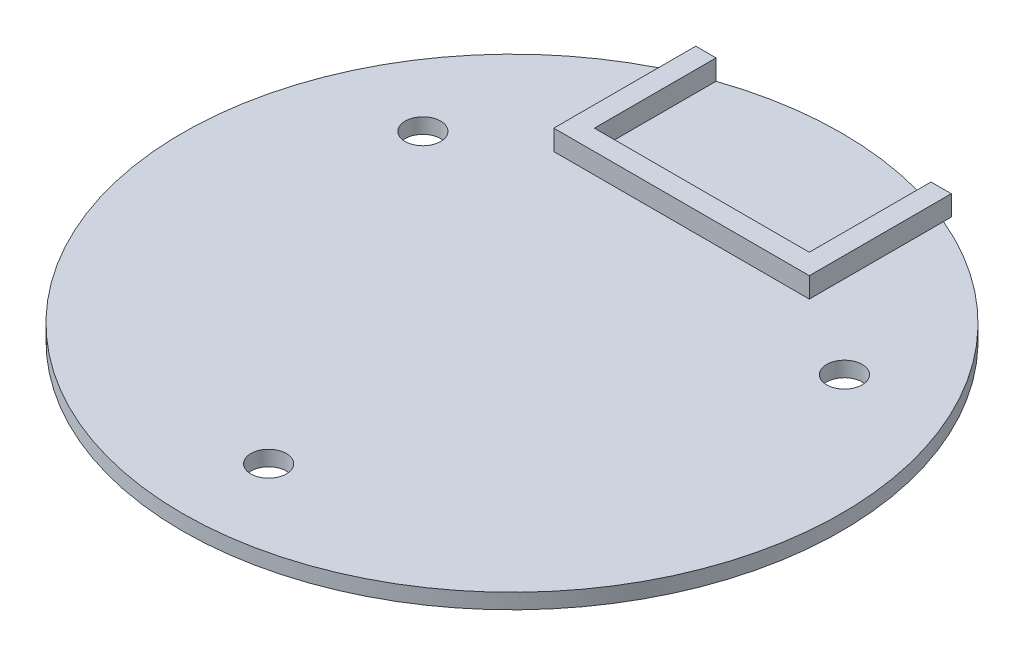
ISO-10303-21;
HEADER;
FILE_DESCRIPTION(('STEP AP214'),'2;1');
FILE_NAME('part.step','',(''),(''),'','','');
FILE_SCHEMA(('AUTOMOTIVE_DESIGN { 1 0 10303 214 1 1 1 1 }'));
ENDSEC;
DATA;
#1=APPLICATION_CONTEXT('core data for automotive mechanical design processes');
#2=APPLICATION_PROTOCOL_DEFINITION('international standard','automotive_design',2000,#1);
#3=PRODUCT_CONTEXT('',#1,'mechanical');
#4=PRODUCT('Part','Part','',(#3));
#5=PRODUCT_RELATED_PRODUCT_CATEGORY('part','',(#4));
#6=PRODUCT_DEFINITION_FORMATION('','',#4);
#7=PRODUCT_DEFINITION_CONTEXT('part definition',#1,'design');
#8=PRODUCT_DEFINITION('design','',#6,#7);
#9=PRODUCT_DEFINITION_SHAPE('','',#8);
#10=(LENGTH_UNIT() NAMED_UNIT(*) SI_UNIT(.MILLI.,.METRE.));
#11=(NAMED_UNIT(*) PLANE_ANGLE_UNIT() SI_UNIT($,.RADIAN.));
#12=(NAMED_UNIT(*) SI_UNIT($,.STERADIAN.) SOLID_ANGLE_UNIT());
#13=UNCERTAINTY_MEASURE_WITH_UNIT(LENGTH_MEASURE(1.E-05),#10,'distance_accuracy_value','');
#14=(GEOMETRIC_REPRESENTATION_CONTEXT(3) GLOBAL_UNCERTAINTY_ASSIGNED_CONTEXT((#13)) GLOBAL_UNIT_ASSIGNED_CONTEXT((#10,
#11,#12)) REPRESENTATION_CONTEXT('',''));
#15=CARTESIAN_POINT('',(0.,0.,0.));
#16=DIRECTION('',(0.,0.,1.));
#17=DIRECTION('',(1.,0.,0.));
#18=AXIS2_PLACEMENT_3D('',#15,#16,#17);
#19=CARTESIAN_POINT('',(0.,1.5,0.));
#20=DIRECTION('',(0.,1.,0.));
#21=DIRECTION('',(0.,0.,1.));
#22=AXIS2_PLACEMENT_3D('',#19,#20,#21);
#23=PLANE('',#22);
#24=DIRECTION('',(0.,0.,-1.));
#25=VECTOR('',#24,1.);
#26=CARTESIAN_POINT('',(-10.6,1.5,-30.7227928417974));
#27=LINE('',#26,#25);
#28=CARTESIAN_POINT('',(-10.6,1.5,-18.7227928417974));
#29=VERTEX_POINT('',#28);
#30=CARTESIAN_POINT('',(-10.6,1.5,-30.7227928417974));
#31=VERTEX_POINT('',#30);
#32=EDGE_CURVE('E63',#29,#31,#27,.T.);
#33=ORIENTED_EDGE('',*,*,#32,.F.);
#34=DIRECTION('',(-1.,0.,0.));
#35=VECTOR('',#34,1.);
#36=CARTESIAN_POINT('',(-10.6,1.5,-18.7227928417974));
#37=LINE('',#36,#35);
#38=CARTESIAN_POINT('',(10.6,1.5,-18.7227928417974));
#39=VERTEX_POINT('',#38);
#40=EDGE_CURVE('E67',#39,#29,#37,.T.);
#41=ORIENTED_EDGE('',*,*,#40,.F.);
#42=DIRECTION('',(0.,0.,1.));
#43=VECTOR('',#42,1.);
#44=CARTESIAN_POINT('',(10.6,1.5,-30.7227928417974));
#45=LINE('',#44,#43);
#46=CARTESIAN_POINT('',(10.6,1.5,-30.7227928417974));
#47=VERTEX_POINT('',#46);
#48=EDGE_CURVE('E177',#47,#39,#45,.T.);
#49=ORIENTED_EDGE('',*,*,#48,.F.);
#50=CARTESIAN_POINT('',(0.,1.5,0.));
#51=DIRECTION('',(0.,1.,0.));
#52=DIRECTION('',(0.,0.,1.));
#53=AXIS2_PLACEMENT_3D('',#50,#51,#52);
#54=CIRCLE('',#53,32.5);
#55=EDGE_CURVE('E150',#47,#31,#54,.T.);
#56=ORIENTED_EDGE('',*,*,#55,.T.);
#57=EDGE_LOOP('',(#33,#41,#49,#56));
#58=FACE_BOUND('',#57,.T.);
#59=ADVANCED_FACE('F45',(#58),#23,.T.);
#60=CARTESIAN_POINT('',(0.,1.5,0.));
#61=DIRECTION('',(0.,-1.,0.));
#62=DIRECTION('',(0.,0.,-1.));
#63=AXIS2_PLACEMENT_3D('',#60,#61,#62);
#64=CYLINDRICAL_SURFACE('',#63,32.5);
#65=CARTESIAN_POINT('',(12.6,1.5,-29.9581374587941));
#66=VERTEX_POINT('',#65);
#67=EDGE_CURVE('E54',#66,#47,#54,.T.);
#68=ORIENTED_EDGE('',*,*,#67,.F.);
#69=CARTESIAN_POINT('',(-12.6,1.5,-29.9581374587941));
#70=VERTEX_POINT('',#69);
#71=EDGE_CURVE('E145',#70,#66,#54,.T.);
#72=ORIENTED_EDGE('',*,*,#71,.F.);
#73=EDGE_CURVE('E156',#31,#70,#54,.T.);
#74=ORIENTED_EDGE('',*,*,#73,.F.);
#75=ORIENTED_EDGE('',*,*,#55,.F.);
#76=EDGE_LOOP('',(#68,#72,#74,#75));
#77=FACE_BOUND('',#76,.T.);
#78=CARTESIAN_POINT('',(0.,0.,0.));
#79=DIRECTION('',(0.,1.,0.));
#80=DIRECTION('',(0.,0.,1.));
#81=AXIS2_PLACEMENT_3D('',#78,#79,#80);
#82=CIRCLE('',#81,32.5);
#83=CARTESIAN_POINT('',(0.,0.,32.5));
#84=VERTEX_POINT('',#83);
#85=EDGE_CURVE('E49',#84,#84,#82,.T.);
#86=ORIENTED_EDGE('',*,*,#85,.T.);
#87=EDGE_LOOP('',(#86));
#88=FACE_BOUND('',#87,.T.);
#89=ADVANCED_FACE('F47',(#77,#88),#64,.T.);
#90=CARTESIAN_POINT('',(20.7846096908265,1.5,-12.0000000000001));
#91=DIRECTION('',(0.,1.,0.));
#92=DIRECTION('',(0.,0.,1.));
#93=AXIS2_PLACEMENT_3D('',#90,#91,#92);
#94=CIRCLE('',#93,1.75);
#95=CARTESIAN_POINT('',(20.7846096908265,1.5,-10.2500000000001));
#96=VERTEX_POINT('',#95);
#97=EDGE_CURVE('E254',#96,#96,#94,.T.);
#98=ORIENTED_EDGE('',*,*,#97,.F.);
#99=EDGE_LOOP('',(#98));
#100=FACE_BOUND('',#99,.T.);
#101=CARTESIAN_POINT('',(-20.7846096908266,1.5,-11.9999999999998));
#102=DIRECTION('',(0.,1.,0.));
#103=DIRECTION('',(0.,0.,1.));
#104=AXIS2_PLACEMENT_3D('',#101,#102,#103);
#105=CIRCLE('',#104,1.75);
#106=CARTESIAN_POINT('',(-20.7846096908266,1.5,-10.2499999999998));
#107=VERTEX_POINT('',#106);
#108=EDGE_CURVE('E258',#107,#107,#105,.T.);
#109=ORIENTED_EDGE('',*,*,#108,.F.);
#110=EDGE_LOOP('',(#109));
#111=FACE_BOUND('',#110,.T.);
#112=CARTESIAN_POINT('',(0.,1.5,24.));
#113=DIRECTION('',(0.,1.,0.));
#114=DIRECTION('',(0.,0.,1.));
#115=AXIS2_PLACEMENT_3D('',#112,#113,#114);
#116=CIRCLE('',#115,1.75);
#117=CARTESIAN_POINT('',(0.,1.5,25.75));
#118=VERTEX_POINT('',#117);
#119=EDGE_CURVE('E168',#118,#118,#116,.T.);
#120=ORIENTED_EDGE('',*,*,#119,.F.);
#121=EDGE_LOOP('',(#120));
#122=FACE_BOUND('',#121,.T.);
#123=DIRECTION('',(0.,0.,-1.));
#124=VECTOR('',#123,1.);
#125=CARTESIAN_POINT('',(12.6,1.5,-30.7227928417974));
#126=LINE('',#125,#124);
#127=CARTESIAN_POINT('',(12.6,1.5,-16.7227928417974));
#128=VERTEX_POINT('',#127);
#129=EDGE_CURVE('E172',#128,#66,#126,.T.);
#130=ORIENTED_EDGE('',*,*,#129,.F.);
#131=DIRECTION('',(1.,0.,0.));
#132=VECTOR('',#131,1.);
#133=CARTESIAN_POINT('',(-12.6,1.5,-16.7227928417974));
#134=LINE('',#133,#132);
#135=CARTESIAN_POINT('',(-12.6,1.5,-16.7227928417974));
#136=VERTEX_POINT('',#135);
#137=EDGE_CURVE('E164',#136,#128,#134,.T.);
#138=ORIENTED_EDGE('',*,*,#137,.F.);
#139=DIRECTION('',(0.,0.,1.));
#140=VECTOR('',#139,1.);
#141=CARTESIAN_POINT('',(-12.6,1.5,-30.7227928417974));
#142=LINE('',#141,#140);
#143=EDGE_CURVE('E11',#70,#136,#142,.T.);
#144=ORIENTED_EDGE('',*,*,#143,.F.);
#145=ORIENTED_EDGE('',*,*,#71,.T.);
#146=EDGE_LOOP('',(#130,#138,#144,#145));
#147=FACE_BOUND('',#146,.T.);
#148=ADVANCED_FACE('F203',(#100,#111,#122,#147),#23,.T.);
#149=CARTESIAN_POINT('',(0.,0.,0.));
#150=DIRECTION('',(0.,1.,0.));
#151=DIRECTION('',(0.,0.,1.));
#152=AXIS2_PLACEMENT_3D('',#149,#150,#151);
#153=PLANE('',#152);
#154=CARTESIAN_POINT('',(20.7846096908265,0.,-12.0000000000001));
#155=DIRECTION('',(0.,-1.,0.));
#156=DIRECTION('',(-0.866025403784436,0.,0.500000000000004));
#157=AXIS2_PLACEMENT_3D('',#154,#155,#156);
#158=CIRCLE('',#157,1.75);
#159=CARTESIAN_POINT('',(19.2690652342037,0.,-11.1250000000001));
#160=VERTEX_POINT('',#159);
#161=EDGE_CURVE('E269',#160,#160,#158,.T.);
#162=ORIENTED_EDGE('',*,*,#161,.F.);
#163=EDGE_LOOP('',(#162));
#164=FACE_BOUND('',#163,.T.);
#165=CARTESIAN_POINT('',(-20.7846096908266,0.,-11.9999999999998));
#166=DIRECTION('',(0.,-1.,0.));
#167=DIRECTION('',(0.866025403784443,0.,0.499999999999992));
#168=AXIS2_PLACEMENT_3D('',#165,#166,#167);
#169=CIRCLE('',#168,1.75);
#170=CARTESIAN_POINT('',(-19.2690652342039,0.,-11.1249999999998));
#171=VERTEX_POINT('',#170);
#172=EDGE_CURVE('E270',#171,#171,#169,.T.);
#173=ORIENTED_EDGE('',*,*,#172,.F.);
#174=EDGE_LOOP('',(#173));
#175=FACE_BOUND('',#174,.T.);
#176=CARTESIAN_POINT('',(0.,0.,24.));
#177=DIRECTION('',(0.,-1.,0.));
#178=DIRECTION('',(0.,0.,-1.));
#179=AXIS2_PLACEMENT_3D('',#176,#177,#178);
#180=CIRCLE('',#179,1.75);
#181=CARTESIAN_POINT('',(0.,0.,22.25));
#182=VERTEX_POINT('',#181);
#183=EDGE_CURVE('E262',#182,#182,#180,.T.);
#184=ORIENTED_EDGE('',*,*,#183,.F.);
#185=EDGE_LOOP('',(#184));
#186=FACE_BOUND('',#185,.T.);
#187=ORIENTED_EDGE('',*,*,#85,.F.);
#188=EDGE_LOOP('',(#187));
#189=FACE_BOUND('',#188,.T.);
#190=ADVANCED_FACE('F244',(#164,#175,#186,#189),#153,.F.);
#191=CARTESIAN_POINT('',(0.,1.5,0.));
#192=DIRECTION('',(0.,1.,0.));
#193=DIRECTION('',(0.,0.,1.));
#194=AXIS2_PLACEMENT_3D('',#191,#192,#193);
#195=PLANE('',#194);
#196=CARTESIAN_POINT('',(12.6,1.5,-30.7227928417974));
#197=VERTEX_POINT('',#196);
#198=EDGE_CURVE('E166',#66,#197,#126,.T.);
#199=ORIENTED_EDGE('',*,*,#198,.F.);
#200=ORIENTED_EDGE('',*,*,#67,.T.);
#201=DIRECTION('',(-1.,0.,0.));
#202=VECTOR('',#201,1.);
#203=CARTESIAN_POINT('',(10.6,1.5,-30.7227928417974));
#204=LINE('',#203,#202);
#205=EDGE_CURVE('E175',#197,#47,#204,.T.);
#206=ORIENTED_EDGE('',*,*,#205,.F.);
#207=EDGE_LOOP('',(#199,#200,#206));
#208=FACE_BOUND('',#207,.T.);
#209=ADVANCED_FACE('F205',(#208),#195,.F.);
#210=DIRECTION('',(-1.,0.,0.));
#211=VECTOR('',#210,1.);
#212=CARTESIAN_POINT('',(-10.6,1.5,-30.7227928417974));
#213=LINE('',#212,#211);
#214=CARTESIAN_POINT('',(-12.6,1.5,-30.7227928417974));
#215=VERTEX_POINT('',#214);
#216=EDGE_CURVE('E142',#31,#215,#213,.T.);
#217=ORIENTED_EDGE('',*,*,#216,.F.);
#218=ORIENTED_EDGE('',*,*,#73,.T.);
#219=EDGE_CURVE('E56',#215,#70,#142,.T.);
#220=ORIENTED_EDGE('',*,*,#219,.F.);
#221=EDGE_LOOP('',(#217,#218,#220));
#222=FACE_BOUND('',#221,.T.);
#223=ADVANCED_FACE('F161',(#222),#195,.F.);
#224=CARTESIAN_POINT('',(-10.6,3.5,-30.7227928417974));
#225=DIRECTION('',(0.,0.,1.));
#226=DIRECTION('',(1.,0.,0.));
#227=AXIS2_PLACEMENT_3D('',#224,#225,#226);
#228=PLANE('',#227);
#229=ORIENTED_EDGE('',*,*,#216,.T.);
#230=DIRECTION('',(0.,-1.,0.));
#231=VECTOR('',#230,1.);
#232=CARTESIAN_POINT('',(-12.6,3.5,-30.7227928417974));
#233=LINE('',#232,#231);
#234=CARTESIAN_POINT('',(-12.6,3.5,-30.7227928417974));
#235=VERTEX_POINT('',#234);
#236=EDGE_CURVE('E123',#235,#215,#233,.T.);
#237=ORIENTED_EDGE('',*,*,#236,.F.);
#238=DIRECTION('',(-1.,0.,0.));
#239=VECTOR('',#238,1.);
#240=CARTESIAN_POINT('',(-10.6,3.5,-30.7227928417974));
#241=LINE('',#240,#239);
#242=CARTESIAN_POINT('',(-10.6,3.5,-30.7227928417974));
#243=VERTEX_POINT('',#242);
#244=EDGE_CURVE('E130',#243,#235,#241,.T.);
#245=ORIENTED_EDGE('',*,*,#244,.F.);
#246=DIRECTION('',(0.,-1.,0.));
#247=VECTOR('',#246,1.);
#248=CARTESIAN_POINT('',(-10.6,3.5,-30.7227928417974));
#249=LINE('',#248,#247);
#250=EDGE_CURVE('E181',#243,#31,#249,.T.);
#251=ORIENTED_EDGE('',*,*,#250,.T.);
#252=EDGE_LOOP('',(#229,#237,#245,#251));
#253=FACE_BOUND('',#252,.T.);
#254=ADVANCED_FACE('F140',(#253),#228,.F.);
#255=CARTESIAN_POINT('',(-12.6,3.5,-30.7227928417974));
#256=DIRECTION('',(1.,0.,0.));
#257=DIRECTION('',(0.,0.,-1.));
#258=AXIS2_PLACEMENT_3D('',#255,#256,#257);
#259=PLANE('',#258);
#260=ORIENTED_EDGE('',*,*,#219,.T.);
#261=ORIENTED_EDGE('',*,*,#143,.T.);
#262=DIRECTION('',(0.,-1.,0.));
#263=VECTOR('',#262,1.);
#264=CARTESIAN_POINT('',(-12.6,3.5,-16.7227928417974));
#265=LINE('',#264,#263);
#266=CARTESIAN_POINT('',(-12.6,3.5,-16.7227928417974));
#267=VERTEX_POINT('',#266);
#268=EDGE_CURVE('E126',#267,#136,#265,.T.);
#269=ORIENTED_EDGE('',*,*,#268,.F.);
#270=DIRECTION('',(0.,0.,1.));
#271=VECTOR('',#270,1.);
#272=CARTESIAN_POINT('',(-12.6,3.5,-30.7227928417974));
#273=LINE('',#272,#271);
#274=EDGE_CURVE('E118',#235,#267,#273,.T.);
#275=ORIENTED_EDGE('',*,*,#274,.F.);
#276=ORIENTED_EDGE('',*,*,#236,.T.);
#277=EDGE_LOOP('',(#260,#261,#269,#275,#276));
#278=FACE_BOUND('',#277,.T.);
#279=ADVANCED_FACE('F121',(#278),#259,.F.);
#280=CARTESIAN_POINT('',(-12.6,3.5,-16.7227928417974));
#281=DIRECTION('',(0.,0.,-1.));
#282=DIRECTION('',(-1.,0.,0.));
#283=AXIS2_PLACEMENT_3D('',#280,#281,#282);
#284=PLANE('',#283);
#285=ORIENTED_EDGE('',*,*,#137,.T.);
#286=DIRECTION('',(0.,-1.,0.));
#287=VECTOR('',#286,1.);
#288=CARTESIAN_POINT('',(12.6,3.5,-16.7227928417974));
#289=LINE('',#288,#287);
#290=CARTESIAN_POINT('',(12.6,3.5,-16.7227928417974));
#291=VERTEX_POINT('',#290);
#292=EDGE_CURVE('E146',#291,#128,#289,.T.);
#293=ORIENTED_EDGE('',*,*,#292,.F.);
#294=DIRECTION('',(1.,0.,0.));
#295=VECTOR('',#294,1.);
#296=CARTESIAN_POINT('',(-12.6,3.5,-16.7227928417974));
#297=LINE('',#296,#295);
#298=EDGE_CURVE('E129',#267,#291,#297,.T.);
#299=ORIENTED_EDGE('',*,*,#298,.F.);
#300=ORIENTED_EDGE('',*,*,#268,.T.);
#301=EDGE_LOOP('',(#285,#293,#299,#300));
#302=FACE_BOUND('',#301,.T.);
#303=ADVANCED_FACE('F202',(#302),#284,.F.);
#304=CARTESIAN_POINT('',(12.6,3.5,-30.7227928417974));
#305=DIRECTION('',(-1.,0.,0.));
#306=DIRECTION('',(0.,0.,1.));
#307=AXIS2_PLACEMENT_3D('',#304,#305,#306);
#308=PLANE('',#307);
#309=ORIENTED_EDGE('',*,*,#129,.T.);
#310=ORIENTED_EDGE('',*,*,#198,.T.);
#311=DIRECTION('',(0.,-1.,0.));
#312=VECTOR('',#311,1.);
#313=CARTESIAN_POINT('',(12.6,3.5,-30.7227928417974));
#314=LINE('',#313,#312);
#315=CARTESIAN_POINT('',(12.6,3.5,-30.7227928417974));
#316=VERTEX_POINT('',#315);
#317=EDGE_CURVE('E192',#316,#197,#314,.T.);
#318=ORIENTED_EDGE('',*,*,#317,.F.);
#319=DIRECTION('',(0.,0.,-1.));
#320=VECTOR('',#319,1.);
#321=CARTESIAN_POINT('',(12.6,3.5,-30.7227928417974));
#322=LINE('',#321,#320);
#323=EDGE_CURVE('E200',#291,#316,#322,.T.);
#324=ORIENTED_EDGE('',*,*,#323,.F.);
#325=ORIENTED_EDGE('',*,*,#292,.T.);
#326=EDGE_LOOP('',(#309,#310,#318,#324,#325));
#327=FACE_BOUND('',#326,.T.);
#328=ADVANCED_FACE('F198',(#327),#308,.F.);
#329=CARTESIAN_POINT('',(10.6,3.5,-30.7227928417974));
#330=DIRECTION('',(0.,0.,1.));
#331=DIRECTION('',(1.,0.,0.));
#332=AXIS2_PLACEMENT_3D('',#329,#330,#331);
#333=PLANE('',#332);
#334=ORIENTED_EDGE('',*,*,#205,.T.);
#335=DIRECTION('',(0.,-1.,0.));
#336=VECTOR('',#335,1.);
#337=CARTESIAN_POINT('',(10.6,3.5,-30.7227928417974));
#338=LINE('',#337,#336);
#339=CARTESIAN_POINT('',(10.6,3.5,-30.7227928417974));
#340=VERTEX_POINT('',#339);
#341=EDGE_CURVE('E189',#340,#47,#338,.T.);
#342=ORIENTED_EDGE('',*,*,#341,.F.);
#343=DIRECTION('',(-1.,0.,0.));
#344=VECTOR('',#343,1.);
#345=CARTESIAN_POINT('',(10.6,3.5,-30.7227928417974));
#346=LINE('',#345,#344);
#347=EDGE_CURVE('E210',#316,#340,#346,.T.);
#348=ORIENTED_EDGE('',*,*,#347,.F.);
#349=ORIENTED_EDGE('',*,*,#317,.T.);
#350=EDGE_LOOP('',(#334,#342,#348,#349));
#351=FACE_BOUND('',#350,.T.);
#352=ADVANCED_FACE('F208',(#351),#333,.F.);
#353=CARTESIAN_POINT('',(10.6,3.5,-30.7227928417974));
#354=DIRECTION('',(1.,0.,0.));
#355=DIRECTION('',(0.,0.,-1.));
#356=AXIS2_PLACEMENT_3D('',#353,#354,#355);
#357=PLANE('',#356);
#358=ORIENTED_EDGE('',*,*,#48,.T.);
#359=DIRECTION('',(0.,-1.,0.));
#360=VECTOR('',#359,1.);
#361=CARTESIAN_POINT('',(10.6,3.5,-18.7227928417974));
#362=LINE('',#361,#360);
#363=CARTESIAN_POINT('',(10.6,3.5,-18.7227928417974));
#364=VERTEX_POINT('',#363);
#365=EDGE_CURVE('E186',#364,#39,#362,.T.);
#366=ORIENTED_EDGE('',*,*,#365,.F.);
#367=DIRECTION('',(0.,0.,1.));
#368=VECTOR('',#367,1.);
#369=CARTESIAN_POINT('',(10.6,3.5,-30.7227928417974));
#370=LINE('',#369,#368);
#371=EDGE_CURVE('E212',#340,#364,#370,.T.);
#372=ORIENTED_EDGE('',*,*,#371,.F.);
#373=ORIENTED_EDGE('',*,*,#341,.T.);
#374=EDGE_LOOP('',(#358,#366,#372,#373));
#375=FACE_BOUND('',#374,.T.);
#376=ADVANCED_FACE('F234',(#375),#357,.F.);
#377=CARTESIAN_POINT('',(-10.6,3.5,-18.7227928417974));
#378=DIRECTION('',(0.,0.,1.));
#379=DIRECTION('',(1.,0.,0.));
#380=AXIS2_PLACEMENT_3D('',#377,#378,#379);
#381=PLANE('',#380);
#382=ORIENTED_EDGE('',*,*,#40,.T.);
#383=DIRECTION('',(0.,-1.,0.));
#384=VECTOR('',#383,1.);
#385=CARTESIAN_POINT('',(-10.6,3.5,-18.7227928417974));
#386=LINE('',#385,#384);
#387=CARTESIAN_POINT('',(-10.6,3.5,-18.7227928417974));
#388=VERTEX_POINT('',#387);
#389=EDGE_CURVE('E183',#388,#29,#386,.T.);
#390=ORIENTED_EDGE('',*,*,#389,.F.);
#391=DIRECTION('',(-1.,0.,0.));
#392=VECTOR('',#391,1.);
#393=CARTESIAN_POINT('',(-10.6,3.5,-18.7227928417974));
#394=LINE('',#393,#392);
#395=EDGE_CURVE('E214',#364,#388,#394,.T.);
#396=ORIENTED_EDGE('',*,*,#395,.F.);
#397=ORIENTED_EDGE('',*,*,#365,.T.);
#398=EDGE_LOOP('',(#382,#390,#396,#397));
#399=FACE_BOUND('',#398,.T.);
#400=ADVANCED_FACE('F223',(#399),#381,.F.);
#401=CARTESIAN_POINT('',(-10.6,3.5,-30.7227928417974));
#402=DIRECTION('',(-1.,0.,0.));
#403=DIRECTION('',(0.,0.,1.));
#404=AXIS2_PLACEMENT_3D('',#401,#402,#403);
#405=PLANE('',#404);
#406=ORIENTED_EDGE('',*,*,#32,.T.);
#407=ORIENTED_EDGE('',*,*,#250,.F.);
#408=DIRECTION('',(0.,0.,-1.));
#409=VECTOR('',#408,1.);
#410=CARTESIAN_POINT('',(-10.6,3.5,-30.7227928417974));
#411=LINE('',#410,#409);
#412=EDGE_CURVE('E135',#388,#243,#411,.T.);
#413=ORIENTED_EDGE('',*,*,#412,.F.);
#414=ORIENTED_EDGE('',*,*,#389,.T.);
#415=EDGE_LOOP('',(#406,#407,#413,#414));
#416=FACE_BOUND('',#415,.T.);
#417=ADVANCED_FACE('F225',(#416),#405,.F.);
#418=CARTESIAN_POINT('',(0.,3.5,0.));
#419=DIRECTION('',(0.,1.,0.));
#420=DIRECTION('',(0.,0.,1.));
#421=AXIS2_PLACEMENT_3D('',#418,#419,#420);
#422=PLANE('',#421);
#423=ORIENTED_EDGE('',*,*,#244,.T.);
#424=ORIENTED_EDGE('',*,*,#274,.T.);
#425=ORIENTED_EDGE('',*,*,#298,.T.);
#426=ORIENTED_EDGE('',*,*,#323,.T.);
#427=ORIENTED_EDGE('',*,*,#347,.T.);
#428=ORIENTED_EDGE('',*,*,#371,.T.);
#429=ORIENTED_EDGE('',*,*,#395,.T.);
#430=ORIENTED_EDGE('',*,*,#412,.T.);
#431=EDGE_LOOP('',(#423,#424,#425,#426,#427,#428,#429,#430));
#432=FACE_BOUND('',#431,.T.);
#433=ADVANCED_FACE('F133',(#432),#422,.T.);
#434=CARTESIAN_POINT('',(0.,7.,24.));
#435=DIRECTION('',(0.,-1.,0.));
#436=DIRECTION('',(0.,0.,-1.));
#437=AXIS2_PLACEMENT_3D('',#434,#435,#436);
#438=CYLINDRICAL_SURFACE('',#437,1.75);
#439=ORIENTED_EDGE('',*,*,#119,.T.);
#440=EDGE_LOOP('',(#439));
#441=FACE_BOUND('',#440,.T.);
#442=ORIENTED_EDGE('',*,*,#183,.T.);
#443=EDGE_LOOP('',(#442));
#444=FACE_BOUND('',#443,.T.);
#445=ADVANCED_FACE('F232',(#441,#444),#438,.F.);
#446=CARTESIAN_POINT('',(-20.7846096908266,7.,-11.9999999999998));
#447=DIRECTION('',(0.,-1.,0.));
#448=DIRECTION('',(0.,0.,-1.));
#449=AXIS2_PLACEMENT_3D('',#446,#447,#448);
#450=CYLINDRICAL_SURFACE('',#449,1.75);
#451=ORIENTED_EDGE('',*,*,#108,.T.);
#452=EDGE_LOOP('',(#451));
#453=FACE_BOUND('',#452,.T.);
#454=ORIENTED_EDGE('',*,*,#172,.T.);
#455=EDGE_LOOP('',(#454));
#456=FACE_BOUND('',#455,.T.);
#457=ADVANCED_FACE('F284',(#453,#456),#450,.F.);
#458=CARTESIAN_POINT('',(20.7846096908265,7.,-12.0000000000001));
#459=DIRECTION('',(0.,-1.,0.));
#460=DIRECTION('',(0.,0.,-1.));
#461=AXIS2_PLACEMENT_3D('',#458,#459,#460);
#462=CYLINDRICAL_SURFACE('',#461,1.75);
#463=ORIENTED_EDGE('',*,*,#97,.T.);
#464=EDGE_LOOP('',(#463));
#465=FACE_BOUND('',#464,.T.);
#466=ORIENTED_EDGE('',*,*,#161,.T.);
#467=EDGE_LOOP('',(#466));
#468=FACE_BOUND('',#467,.T.);
#469=ADVANCED_FACE('F276',(#465,#468),#462,.F.);
#470=CLOSED_SHELL('',(#59,#89,#148,#190,#209,#223,#254,#279,#303,#328,#352,#376,#400,#417,#433,
#445,#457,#469));
#471=MANIFOLD_SOLID_BREP('B2',#470);
#472=ADVANCED_BREP_SHAPE_REPRESENTATION('',(#18,#471),#14);
#473=SHAPE_DEFINITION_REPRESENTATION(#9,#472);
ENDSEC;
END-ISO-10303-21;
